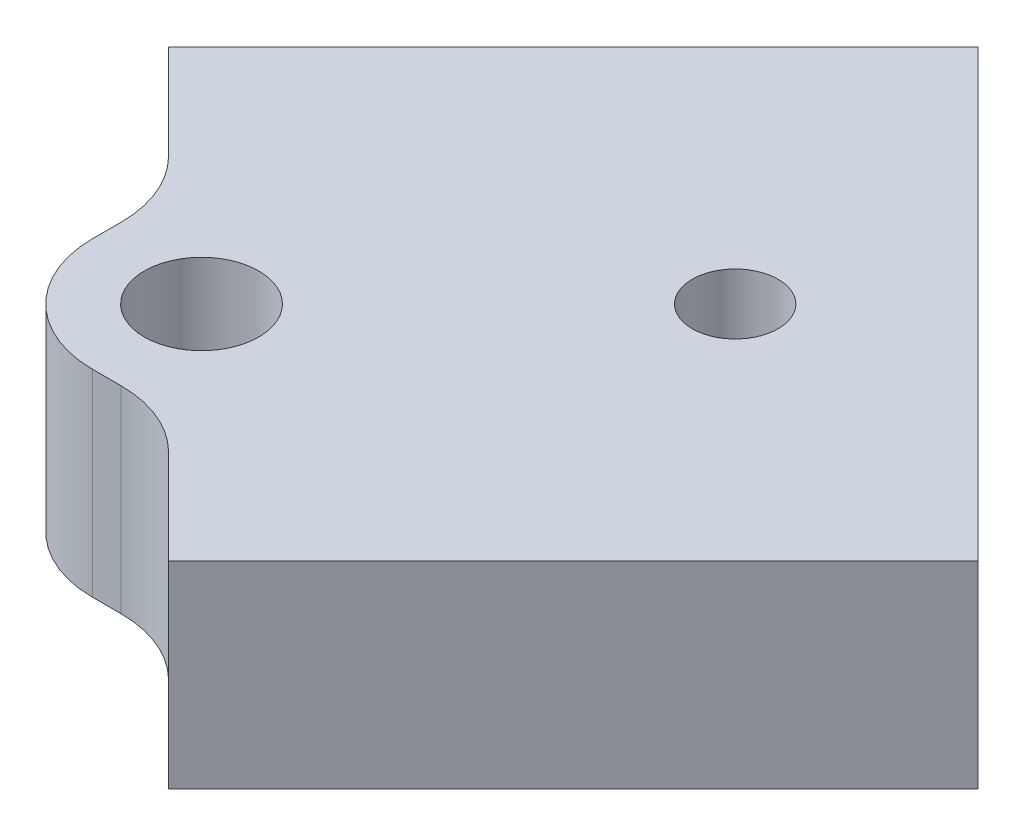
ISO-10303-21;
HEADER;
FILE_DESCRIPTION(('STEP AP214'),'2;1');
FILE_NAME('part.step','',(''),(''),'','','');
FILE_SCHEMA(('AUTOMOTIVE_DESIGN { 1 0 10303 214 1 1 1 1 }'));
ENDSEC;
DATA;
#1=APPLICATION_CONTEXT('core data for automotive mechanical design processes');
#2=APPLICATION_PROTOCOL_DEFINITION('international standard','automotive_design',2000,#1);
#3=PRODUCT_CONTEXT('',#1,'mechanical');
#4=PRODUCT('Part','Part','',(#3));
#5=PRODUCT_RELATED_PRODUCT_CATEGORY('part','',(#4));
#6=PRODUCT_DEFINITION_FORMATION('','',#4);
#7=PRODUCT_DEFINITION_CONTEXT('part definition',#1,'design');
#8=PRODUCT_DEFINITION('design','',#6,#7);
#9=PRODUCT_DEFINITION_SHAPE('','',#8);
#10=(LENGTH_UNIT() NAMED_UNIT(*) SI_UNIT(.MILLI.,.METRE.));
#11=(NAMED_UNIT(*) PLANE_ANGLE_UNIT() SI_UNIT($,.RADIAN.));
#12=(NAMED_UNIT(*) SI_UNIT($,.STERADIAN.) SOLID_ANGLE_UNIT());
#13=UNCERTAINTY_MEASURE_WITH_UNIT(LENGTH_MEASURE(1.E-05),#10,'distance_accuracy_value','');
#14=(GEOMETRIC_REPRESENTATION_CONTEXT(3) GLOBAL_UNCERTAINTY_ASSIGNED_CONTEXT((#13)) GLOBAL_UNIT_ASSIGNED_CONTEXT((#10,
#11,#12)) REPRESENTATION_CONTEXT('',''));
#15=CARTESIAN_POINT('',(0.,0.,0.));
#16=DIRECTION('',(0.,0.,1.));
#17=DIRECTION('',(1.,0.,0.));
#18=AXIS2_PLACEMENT_3D('',#15,#16,#17);
#19=CARTESIAN_POINT('',(1.,6.9,7.95));
#20=DIRECTION('',(0.,-1.,0.));
#21=DIRECTION('',(0.,0.,-1.));
#22=AXIS2_PLACEMENT_3D('',#19,#20,#21);
#23=CYLINDRICAL_SURFACE('',#22,4.);
#24=CARTESIAN_POINT('',(1.,0.,7.95));
#25=DIRECTION('',(0.,-1.,0.));
#26=DIRECTION('',(0.,0.,1.));
#27=AXIS2_PLACEMENT_3D('',#24,#25,#26);
#28=CIRCLE('',#27,4.);
#29=CARTESIAN_POINT('',(1.,0.,3.95));
#30=VERTEX_POINT('',#29);
#31=CARTESIAN_POINT('',(3.82842712474619,0.,5.12157287525381));
#32=VERTEX_POINT('',#31);
#33=EDGE_CURVE('E146',#30,#32,#28,.T.);
#34=ORIENTED_EDGE('',*,*,#33,.T.);
#35=DIRECTION('',(0.,-1.,0.));
#36=VECTOR('',#35,1.);
#37=CARTESIAN_POINT('',(3.82842712474619,6.9,5.12157287525381));
#38=LINE('',#37,#36);
#39=CARTESIAN_POINT('',(3.82842712474619,6.9,5.12157287525381));
#40=VERTEX_POINT('',#39);
#41=EDGE_CURVE('E11',#40,#32,#38,.T.);
#42=ORIENTED_EDGE('',*,*,#41,.F.);
#43=CARTESIAN_POINT('',(1.,6.9,7.95));
#44=DIRECTION('',(0.,-1.,0.));
#45=DIRECTION('',(0.,0.,1.));
#46=AXIS2_PLACEMENT_3D('',#43,#44,#45);
#47=CIRCLE('',#46,4.);
#48=CARTESIAN_POINT('',(1.,6.9,3.95));
#49=VERTEX_POINT('',#48);
#50=EDGE_CURVE('E166',#49,#40,#47,.T.);
#51=ORIENTED_EDGE('',*,*,#50,.F.);
#52=DIRECTION('',(0.,-1.,0.));
#53=VECTOR('',#52,1.);
#54=CARTESIAN_POINT('',(1.,6.9,3.95));
#55=LINE('',#54,#53);
#56=EDGE_CURVE('E143',#49,#30,#55,.T.);
#57=ORIENTED_EDGE('',*,*,#56,.T.);
#58=EDGE_LOOP('',(#34,#42,#51,#57));
#59=FACE_BOUND('',#58,.T.);
#60=ADVANCED_FACE('F41',(#59),#23,.F.);
#61=CARTESIAN_POINT('',(3.82842712474619,6.9,5.12157287525381));
#62=DIRECTION('',(0.707106781186547,0.,-0.707106781186548));
#63=DIRECTION('',(-0.707106781186548,0.,-0.707106781186547));
#64=AXIS2_PLACEMENT_3D('',#61,#62,#63);
#65=PLANE('',#64);
#66=DIRECTION('',(0.707106781186548,0.,0.707106781186547));
#67=VECTOR('',#66,1.);
#68=CARTESIAN_POINT('',(3.82842712474619,0.,5.12157287525381));
#69=LINE('',#68,#67);
#70=CARTESIAN_POINT('',(7.13160171779821,0.,8.42474746830583));
#71=VERTEX_POINT('',#70);
#72=EDGE_CURVE('E155',#32,#71,#69,.T.);
#73=ORIENTED_EDGE('',*,*,#72,.T.);
#74=DIRECTION('',(0.,-1.,0.));
#75=VECTOR('',#74,1.);
#76=CARTESIAN_POINT('',(7.13160171779821,6.9,8.42474746830583));
#77=LINE('',#76,#75);
#78=CARTESIAN_POINT('',(7.13160171779821,6.9,8.42474746830583));
#79=VERTEX_POINT('',#78);
#80=EDGE_CURVE('E47',#79,#71,#77,.T.);
#81=ORIENTED_EDGE('',*,*,#80,.F.);
#82=DIRECTION('',(0.707106781186548,0.,0.707106781186547));
#83=VECTOR('',#82,1.);
#84=CARTESIAN_POINT('',(3.82842712474619,6.9,5.12157287525381));
#85=LINE('',#84,#83);
#86=EDGE_CURVE('E106',#40,#79,#85,.T.);
#87=ORIENTED_EDGE('',*,*,#86,.F.);
#88=ORIENTED_EDGE('',*,*,#41,.T.);
#89=EDGE_LOOP('',(#73,#81,#87,#88));
#90=FACE_BOUND('',#89,.T.);
#91=ADVANCED_FACE('F249',(#90),#65,.F.);
#92=CARTESIAN_POINT('',(21.2737373415292,6.9,-5.71738815542511));
#93=DIRECTION('',(-0.707106781186548,0.,-0.707106781186547));
#94=DIRECTION('',(-0.707106781186547,0.,0.707106781186548));
#95=AXIS2_PLACEMENT_3D('',#92,#93,#94);
#96=PLANE('',#95);
#97=DIRECTION('',(0.707106781186547,0.,-0.707106781186548));
#98=VECTOR('',#97,1.);
#99=CARTESIAN_POINT('',(21.2737373415292,0.,-5.71738815542511));
#100=LINE('',#99,#98);
#101=CARTESIAN_POINT('',(21.2737373415292,0.,-5.71738815542511));
#102=VERTEX_POINT('',#101);
#103=EDGE_CURVE('E153',#71,#102,#100,.T.);
#104=ORIENTED_EDGE('',*,*,#103,.T.);
#105=DIRECTION('',(0.,-1.,0.));
#106=VECTOR('',#105,1.);
#107=CARTESIAN_POINT('',(21.2737373415292,6.9,-5.71738815542511));
#108=LINE('',#107,#106);
#109=CARTESIAN_POINT('',(21.2737373415292,6.9,-5.71738815542511));
#110=VERTEX_POINT('',#109);
#111=EDGE_CURVE('E181',#110,#102,#108,.T.);
#112=ORIENTED_EDGE('',*,*,#111,.F.);
#113=DIRECTION('',(0.707106781186547,0.,-0.707106781186548));
#114=VECTOR('',#113,1.);
#115=CARTESIAN_POINT('',(21.2737373415292,6.9,-5.71738815542511));
#116=LINE('',#115,#114);
#117=EDGE_CURVE('E186',#79,#110,#116,.T.);
#118=ORIENTED_EDGE('',*,*,#117,.F.);
#119=ORIENTED_EDGE('',*,*,#80,.T.);
#120=EDGE_LOOP('',(#104,#112,#118,#119));
#121=FACE_BOUND('',#120,.T.);
#122=ADVANCED_FACE('F190',(#121),#96,.F.);
#123=CARTESIAN_POINT('',(5.71738815542511,6.9,-21.2737373415292));
#124=DIRECTION('',(-0.707106781186548,0.,0.707106781186547));
#125=DIRECTION('',(0.707106781186547,0.,0.707106781186548));
#126=AXIS2_PLACEMENT_3D('',#123,#124,#125);
#127=PLANE('',#126);
#128=DIRECTION('',(-0.707106781186547,0.,-0.707106781186548));
#129=VECTOR('',#128,1.);
#130=CARTESIAN_POINT('',(5.71738815542511,0.,-21.2737373415292));
#131=LINE('',#130,#129);
#132=CARTESIAN_POINT('',(5.71738815542511,0.,-21.2737373415292));
#133=VERTEX_POINT('',#132);
#134=EDGE_CURVE('E160',#102,#133,#131,.T.);
#135=ORIENTED_EDGE('',*,*,#134,.T.);
#136=DIRECTION('',(0.,-1.,0.));
#137=VECTOR('',#136,1.);
#138=CARTESIAN_POINT('',(5.71738815542511,6.9,-21.2737373415292));
#139=LINE('',#138,#137);
#140=CARTESIAN_POINT('',(5.71738815542511,6.9,-21.2737373415292));
#141=VERTEX_POINT('',#140);
#142=EDGE_CURVE('E178',#141,#133,#139,.T.);
#143=ORIENTED_EDGE('',*,*,#142,.F.);
#144=DIRECTION('',(-0.707106781186547,0.,-0.707106781186548));
#145=VECTOR('',#144,1.);
#146=CARTESIAN_POINT('',(5.71738815542511,6.9,-21.2737373415292));
#147=LINE('',#146,#145);
#148=EDGE_CURVE('E210',#110,#141,#147,.T.);
#149=ORIENTED_EDGE('',*,*,#148,.F.);
#150=ORIENTED_EDGE('',*,*,#111,.T.);
#151=EDGE_LOOP('',(#135,#143,#149,#150));
#152=FACE_BOUND('',#151,.T.);
#153=ADVANCED_FACE('F199',(#152),#127,.F.);
#154=CARTESIAN_POINT('',(-8.42474746830583,6.9,-7.13160171779821));
#155=DIRECTION('',(0.707106781186548,0.,0.707106781186547));
#156=DIRECTION('',(0.707106781186547,0.,-0.707106781186548));
#157=AXIS2_PLACEMENT_3D('',#154,#155,#156);
#158=PLANE('',#157);
#159=DIRECTION('',(-0.707106781186547,0.,0.707106781186548));
#160=VECTOR('',#159,1.);
#161=CARTESIAN_POINT('',(-8.42474746830583,0.,-7.13160171779821));
#162=LINE('',#161,#160);
#163=CARTESIAN_POINT('',(-8.42474746830583,0.,-7.13160171779821));
#164=VERTEX_POINT('',#163);
#165=EDGE_CURVE('E156',#133,#164,#162,.T.);
#166=ORIENTED_EDGE('',*,*,#165,.T.);
#167=DIRECTION('',(0.,-1.,0.));
#168=VECTOR('',#167,1.);
#169=CARTESIAN_POINT('',(-8.42474746830583,6.9,-7.13160171779821));
#170=LINE('',#169,#168);
#171=CARTESIAN_POINT('',(-8.42474746830583,6.9,-7.13160171779821));
#172=VERTEX_POINT('',#171);
#173=EDGE_CURVE('E174',#172,#164,#170,.T.);
#174=ORIENTED_EDGE('',*,*,#173,.F.);
#175=DIRECTION('',(-0.707106781186547,0.,0.707106781186548));
#176=VECTOR('',#175,1.);
#177=CARTESIAN_POINT('',(-8.42474746830583,6.9,-7.13160171779821));
#178=LINE('',#177,#176);
#179=EDGE_CURVE('E203',#141,#172,#178,.T.);
#180=ORIENTED_EDGE('',*,*,#179,.F.);
#181=ORIENTED_EDGE('',*,*,#142,.T.);
#182=EDGE_LOOP('',(#166,#174,#180,#181));
#183=FACE_BOUND('',#182,.T.);
#184=ADVANCED_FACE('F201',(#183),#158,.F.);
#185=CARTESIAN_POINT('',(-8.42474746830583,6.9,-7.13160171779821));
#186=DIRECTION('',(0.707106781186547,0.,-0.707106781186547));
#187=DIRECTION('',(-0.707106781186548,0.,-0.707106781186548));
#188=AXIS2_PLACEMENT_3D('',#185,#186,#187);
#189=PLANE('',#188);
#190=DIRECTION('',(0.707106781186548,0.,0.707106781186548));
#191=VECTOR('',#190,1.);
#192=CARTESIAN_POINT('',(-8.42474746830583,0.,-7.13160171779821));
#193=LINE('',#192,#191);
#194=CARTESIAN_POINT('',(-5.12157287525381,0.,-3.82842712474619));
#195=VERTEX_POINT('',#194);
#196=EDGE_CURVE('E163',#164,#195,#193,.T.);
#197=ORIENTED_EDGE('',*,*,#196,.T.);
#198=DIRECTION('',(0.,-1.,0.));
#199=VECTOR('',#198,1.);
#200=CARTESIAN_POINT('',(-5.12157287525381,6.9,-3.82842712474619));
#201=LINE('',#200,#199);
#202=CARTESIAN_POINT('',(-5.12157287525381,6.9,-3.82842712474619));
#203=VERTEX_POINT('',#202);
#204=EDGE_CURVE('E175',#203,#195,#201,.T.);
#205=ORIENTED_EDGE('',*,*,#204,.F.);
#206=DIRECTION('',(0.707106781186548,0.,0.707106781186548));
#207=VECTOR('',#206,1.);
#208=CARTESIAN_POINT('',(-8.42474746830583,6.9,-7.13160171779821));
#209=LINE('',#208,#207);
#210=EDGE_CURVE('E207',#172,#203,#209,.T.);
#211=ORIENTED_EDGE('',*,*,#210,.F.);
#212=ORIENTED_EDGE('',*,*,#173,.T.);
#213=EDGE_LOOP('',(#197,#205,#211,#212));
#214=FACE_BOUND('',#213,.T.);
#215=ADVANCED_FACE('F265',(#214),#189,.F.);
#216=CARTESIAN_POINT('',(-7.95,6.9,-1.));
#217=DIRECTION('',(0.,-1.,0.));
#218=DIRECTION('',(0.,0.,-1.));
#219=AXIS2_PLACEMENT_3D('',#216,#217,#218);
#220=CYLINDRICAL_SURFACE('',#219,4.);
#221=CARTESIAN_POINT('',(-7.95,0.,-1.));
#222=DIRECTION('',(0.,-1.,0.));
#223=DIRECTION('',(0.,0.,1.));
#224=AXIS2_PLACEMENT_3D('',#221,#222,#223);
#225=CIRCLE('',#224,4.);
#226=CARTESIAN_POINT('',(-3.95,0.,-1.));
#227=VERTEX_POINT('',#226);
#228=EDGE_CURVE('E161',#195,#227,#225,.T.);
#229=ORIENTED_EDGE('',*,*,#228,.T.);
#230=DIRECTION('',(0.,-1.,0.));
#231=VECTOR('',#230,1.);
#232=CARTESIAN_POINT('',(-3.95,6.9,-1.));
#233=LINE('',#232,#231);
#234=CARTESIAN_POINT('',(-3.95,6.9,-1.));
#235=VERTEX_POINT('',#234);
#236=EDGE_CURVE('E137',#235,#227,#233,.T.);
#237=ORIENTED_EDGE('',*,*,#236,.F.);
#238=CARTESIAN_POINT('',(-7.95,6.9,-1.));
#239=DIRECTION('',(0.,-1.,0.));
#240=DIRECTION('',(0.,0.,1.));
#241=AXIS2_PLACEMENT_3D('',#238,#239,#240);
#242=CIRCLE('',#241,4.);
#243=EDGE_CURVE('E132',#203,#235,#242,.T.);
#244=ORIENTED_EDGE('',*,*,#243,.F.);
#245=ORIENTED_EDGE('',*,*,#204,.T.);
#246=EDGE_LOOP('',(#229,#237,#244,#245));
#247=FACE_BOUND('',#246,.T.);
#248=ADVANCED_FACE('F256',(#247),#220,.F.);
#249=CARTESIAN_POINT('',(-3.95,6.9,0.));
#250=DIRECTION('',(1.,0.,0.));
#251=DIRECTION('',(0.,0.,-1.));
#252=AXIS2_PLACEMENT_3D('',#249,#250,#251);
#253=PLANE('',#252);
#254=DIRECTION('',(0.,0.,1.));
#255=VECTOR('',#254,1.);
#256=CARTESIAN_POINT('',(-3.95,0.,0.));
#257=LINE('',#256,#255);
#258=CARTESIAN_POINT('',(-3.95,0.,0.));
#259=VERTEX_POINT('',#258);
#260=EDGE_CURVE('E138',#227,#259,#257,.T.);
#261=ORIENTED_EDGE('',*,*,#260,.T.);
#262=DIRECTION('',(0.,-1.,0.));
#263=VECTOR('',#262,1.);
#264=CARTESIAN_POINT('',(-3.95,6.9,0.));
#265=LINE('',#264,#263);
#266=CARTESIAN_POINT('',(-3.95,6.9,0.));
#267=VERTEX_POINT('',#266);
#268=EDGE_CURVE('E139',#267,#259,#265,.T.);
#269=ORIENTED_EDGE('',*,*,#268,.F.);
#270=DIRECTION('',(0.,0.,1.));
#271=VECTOR('',#270,1.);
#272=CARTESIAN_POINT('',(-3.95,6.9,0.));
#273=LINE('',#272,#271);
#274=EDGE_CURVE('E123',#235,#267,#273,.T.);
#275=ORIENTED_EDGE('',*,*,#274,.F.);
#276=ORIENTED_EDGE('',*,*,#236,.T.);
#277=EDGE_LOOP('',(#261,#269,#275,#276));
#278=FACE_BOUND('',#277,.T.);
#279=ADVANCED_FACE('F136',(#278),#253,.F.);
#280=CARTESIAN_POINT('',(0.,6.9,0.));
#281=DIRECTION('',(0.,-1.,0.));
#282=DIRECTION('',(0.,0.,-1.));
#283=AXIS2_PLACEMENT_3D('',#280,#281,#282);
#284=CYLINDRICAL_SURFACE('',#283,3.95);
#285=CARTESIAN_POINT('',(0.,0.,0.));
#286=DIRECTION('',(0.,1.,0.));
#287=DIRECTION('',(0.,0.,1.));
#288=AXIS2_PLACEMENT_3D('',#285,#286,#287);
#289=CIRCLE('',#288,3.95);
#290=CARTESIAN_POINT('',(0.,0.,3.95));
#291=VERTEX_POINT('',#290);
#292=EDGE_CURVE('E95',#259,#291,#289,.T.);
#293=ORIENTED_EDGE('',*,*,#292,.T.);
#294=DIRECTION('',(0.,-1.,0.));
#295=VECTOR('',#294,1.);
#296=CARTESIAN_POINT('',(0.,6.9,3.95));
#297=LINE('',#296,#295);
#298=CARTESIAN_POINT('',(0.,6.9,3.95));
#299=VERTEX_POINT('',#298);
#300=EDGE_CURVE('E142',#299,#291,#297,.T.);
#301=ORIENTED_EDGE('',*,*,#300,.F.);
#302=CARTESIAN_POINT('',(0.,6.9,0.));
#303=DIRECTION('',(0.,1.,0.));
#304=DIRECTION('',(0.,0.,1.));
#305=AXIS2_PLACEMENT_3D('',#302,#303,#304);
#306=CIRCLE('',#305,3.95);
#307=EDGE_CURVE('E126',#267,#299,#306,.T.);
#308=ORIENTED_EDGE('',*,*,#307,.F.);
#309=ORIENTED_EDGE('',*,*,#268,.T.);
#310=EDGE_LOOP('',(#293,#301,#308,#309));
#311=FACE_BOUND('',#310,.T.);
#312=ADVANCED_FACE('F141',(#311),#284,.T.);
#313=CARTESIAN_POINT('',(0.,6.9,3.95));
#314=DIRECTION('',(0.,0.,-1.));
#315=DIRECTION('',(-1.,0.,0.));
#316=AXIS2_PLACEMENT_3D('',#313,#314,#315);
#317=PLANE('',#316);
#318=DIRECTION('',(1.,0.,0.));
#319=VECTOR('',#318,1.);
#320=CARTESIAN_POINT('',(0.,0.,3.95));
#321=LINE('',#320,#319);
#322=EDGE_CURVE('E96',#291,#30,#321,.T.);
#323=ORIENTED_EDGE('',*,*,#322,.T.);
#324=ORIENTED_EDGE('',*,*,#56,.F.);
#325=DIRECTION('',(1.,0.,0.));
#326=VECTOR('',#325,1.);
#327=CARTESIAN_POINT('',(0.,6.9,3.95));
#328=LINE('',#327,#326);
#329=EDGE_CURVE('E60',#299,#49,#328,.T.);
#330=ORIENTED_EDGE('',*,*,#329,.F.);
#331=ORIENTED_EDGE('',*,*,#300,.T.);
#332=EDGE_LOOP('',(#323,#324,#330,#331));
#333=FACE_BOUND('',#332,.T.);
#334=ADVANCED_FACE('F233',(#333),#317,.F.);
#335=CARTESIAN_POINT('',(1.,6.9,7.95));
#336=DIRECTION('',(0.,1.,0.));
#337=DIRECTION('',(0.,0.,1.));
#338=AXIS2_PLACEMENT_3D('',#335,#336,#337);
#339=PLANE('',#338);
#340=CARTESIAN_POINT('',(9.25292206135777,6.9,-9.25292206135794));
#341=DIRECTION('',(0.,1.,0.));
#342=DIRECTION('',(0.,0.,1.));
#343=AXIS2_PLACEMENT_3D('',#340,#341,#342);
#344=CIRCLE('',#343,1.5);
#345=CARTESIAN_POINT('',(9.25292206135777,6.9,-7.75292206135794));
#346=VERTEX_POINT('',#345);
#347=EDGE_CURVE('E224',#346,#346,#344,.T.);
#348=ORIENTED_EDGE('',*,*,#347,.F.);
#349=EDGE_LOOP('',(#348));
#350=FACE_BOUND('',#349,.T.);
#351=CARTESIAN_POINT('',(-0.0707106781186546,6.9,0.0707106781186549));
#352=DIRECTION('',(0.,1.,0.));
#353=DIRECTION('',(0.,0.,1.));
#354=AXIS2_PLACEMENT_3D('',#351,#352,#353);
#355=CIRCLE('',#354,1.99999999999999);
#356=CARTESIAN_POINT('',(-0.0707106781186546,6.9,2.07071067811864));
#357=VERTEX_POINT('',#356);
#358=EDGE_CURVE('E220',#357,#357,#355,.T.);
#359=ORIENTED_EDGE('',*,*,#358,.F.);
#360=EDGE_LOOP('',(#359));
#361=FACE_BOUND('',#360,.T.);
#362=ORIENTED_EDGE('',*,*,#50,.T.);
#363=ORIENTED_EDGE('',*,*,#86,.T.);
#364=ORIENTED_EDGE('',*,*,#117,.T.);
#365=ORIENTED_EDGE('',*,*,#148,.T.);
#366=ORIENTED_EDGE('',*,*,#179,.T.);
#367=ORIENTED_EDGE('',*,*,#210,.T.);
#368=ORIENTED_EDGE('',*,*,#243,.T.);
#369=ORIENTED_EDGE('',*,*,#274,.T.);
#370=ORIENTED_EDGE('',*,*,#307,.T.);
#371=ORIENTED_EDGE('',*,*,#329,.T.);
#372=EDGE_LOOP('',(#362,#363,#364,#365,#366,#367,#368,#369,#370,#371));
#373=FACE_BOUND('',#372,.T.);
#374=ADVANCED_FACE('F130',(#350,#361,#373),#339,.T.);
#375=CARTESIAN_POINT('',(1.,0.,7.95));
#376=DIRECTION('',(0.,1.,0.));
#377=DIRECTION('',(0.,0.,1.));
#378=AXIS2_PLACEMENT_3D('',#375,#376,#377);
#379=PLANE('',#378);
#380=CARTESIAN_POINT('',(9.25292206135777,0.,-9.25292206135794));
#381=DIRECTION('',(0.,1.,0.));
#382=DIRECTION('',(0.,0.,1.));
#383=AXIS2_PLACEMENT_3D('',#380,#381,#382);
#384=CIRCLE('',#383,1.5);
#385=CARTESIAN_POINT('',(9.25292206135777,0.,-7.75292206135794));
#386=VERTEX_POINT('',#385);
#387=EDGE_CURVE('E218',#386,#386,#384,.T.);
#388=ORIENTED_EDGE('',*,*,#387,.T.);
#389=EDGE_LOOP('',(#388));
#390=FACE_BOUND('',#389,.T.);
#391=CARTESIAN_POINT('',(-0.0707106781186546,0.,0.0707106781186549));
#392=DIRECTION('',(0.,1.,0.));
#393=DIRECTION('',(0.,0.,1.));
#394=AXIS2_PLACEMENT_3D('',#391,#392,#393);
#395=CIRCLE('',#394,2.);
#396=CARTESIAN_POINT('',(-0.0707106781186546,0.,2.07071067811865));
#397=VERTEX_POINT('',#396);
#398=EDGE_CURVE('E154',#397,#397,#395,.T.);
#399=ORIENTED_EDGE('',*,*,#398,.T.);
#400=EDGE_LOOP('',(#399));
#401=FACE_BOUND('',#400,.T.);
#402=ORIENTED_EDGE('',*,*,#33,.F.);
#403=ORIENTED_EDGE('',*,*,#322,.F.);
#404=ORIENTED_EDGE('',*,*,#292,.F.);
#405=ORIENTED_EDGE('',*,*,#260,.F.);
#406=ORIENTED_EDGE('',*,*,#228,.F.);
#407=ORIENTED_EDGE('',*,*,#196,.F.);
#408=ORIENTED_EDGE('',*,*,#165,.F.);
#409=ORIENTED_EDGE('',*,*,#134,.F.);
#410=ORIENTED_EDGE('',*,*,#103,.F.);
#411=ORIENTED_EDGE('',*,*,#72,.F.);
#412=EDGE_LOOP('',(#402,#403,#404,#405,#406,#407,#408,#409,#410,#411));
#413=FACE_BOUND('',#412,.T.);
#414=ADVANCED_FACE('F194',(#390,#401,#413),#379,.F.);
#415=CARTESIAN_POINT('',(-0.0707106781186546,6.9,0.0707106781186549));
#416=DIRECTION('',(0.,1.,0.));
#417=DIRECTION('',(0.,0.,1.));
#418=AXIS2_PLACEMENT_3D('',#415,#416,#417);
#419=CYLINDRICAL_SURFACE('',#418,1.99999999999999);
#420=ORIENTED_EDGE('',*,*,#398,.F.);
#421=EDGE_LOOP('',(#420));
#422=FACE_BOUND('',#421,.T.);
#423=ORIENTED_EDGE('',*,*,#358,.T.);
#424=EDGE_LOOP('',(#423));
#425=FACE_BOUND('',#424,.T.);
#426=ADVANCED_FACE('F232',(#422,#425),#419,.F.);
#427=CARTESIAN_POINT('',(9.25292206135777,6.9,-9.25292206135794));
#428=DIRECTION('',(0.,1.,0.));
#429=DIRECTION('',(0.,0.,1.));
#430=AXIS2_PLACEMENT_3D('',#427,#428,#429);
#431=CYLINDRICAL_SURFACE('',#430,1.5);
#432=ORIENTED_EDGE('',*,*,#387,.F.);
#433=EDGE_LOOP('',(#432));
#434=FACE_BOUND('',#433,.T.);
#435=ORIENTED_EDGE('',*,*,#347,.T.);
#436=EDGE_LOOP('',(#435));
#437=FACE_BOUND('',#436,.T.);
#438=ADVANCED_FACE('F227',(#434,#437),#431,.F.);
#439=CLOSED_SHELL('',(#60,#91,#122,#153,#184,#215,#248,#279,#312,#334,#374,#414,#426,#438));
#440=MANIFOLD_SOLID_BREP('B2',#439);
#441=ADVANCED_BREP_SHAPE_REPRESENTATION('',(#18,#440),#14);
#442=SHAPE_DEFINITION_REPRESENTATION(#9,#441);
ENDSEC;
END-ISO-10303-21;
